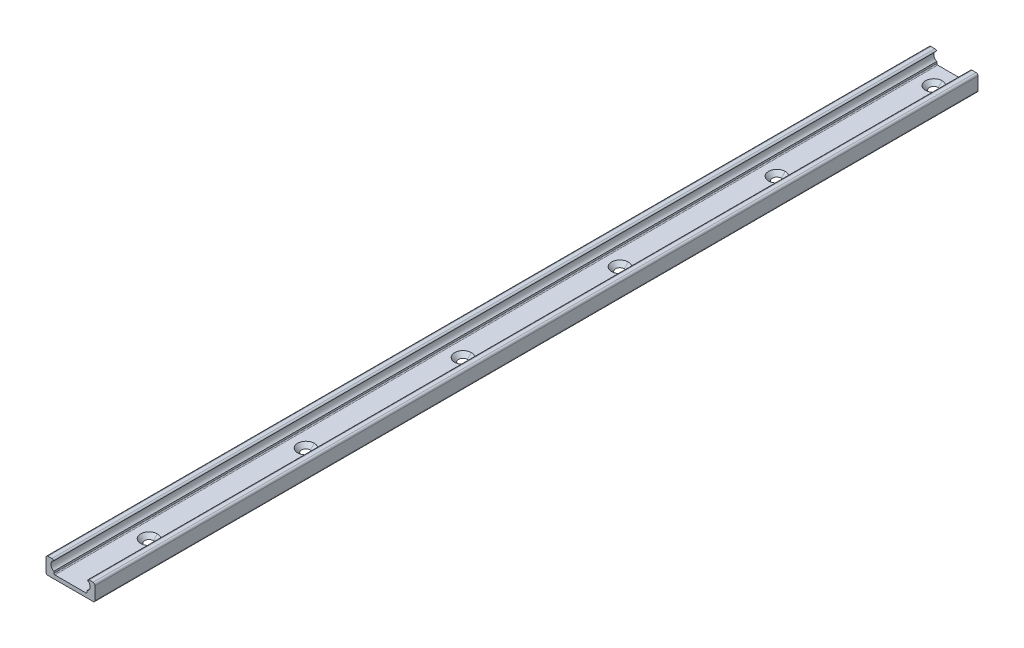
ISO-10303-21;
HEADER;
FILE_DESCRIPTION(('STEP AP214'),'2;1');
FILE_NAME('part.step','',(''),(''),'','','');
FILE_SCHEMA(('AUTOMOTIVE_DESIGN { 1 0 10303 214 1 1 1 1 }'));
ENDSEC;
DATA;
#1=APPLICATION_CONTEXT('core data for automotive mechanical design processes');
#2=APPLICATION_PROTOCOL_DEFINITION('international standard','automotive_design',2000,#1);
#3=PRODUCT_CONTEXT('',#1,'mechanical');
#4=PRODUCT('Part','Part','',(#3));
#5=PRODUCT_RELATED_PRODUCT_CATEGORY('part','',(#4));
#6=PRODUCT_DEFINITION_FORMATION('','',#4);
#7=PRODUCT_DEFINITION_CONTEXT('part definition',#1,'design');
#8=PRODUCT_DEFINITION('design','',#6,#7);
#9=PRODUCT_DEFINITION_SHAPE('','',#8);
#10=(LENGTH_UNIT() NAMED_UNIT(*) SI_UNIT(.MILLI.,.METRE.));
#11=(NAMED_UNIT(*) PLANE_ANGLE_UNIT() SI_UNIT($,.RADIAN.));
#12=(NAMED_UNIT(*) SI_UNIT($,.STERADIAN.) SOLID_ANGLE_UNIT());
#13=UNCERTAINTY_MEASURE_WITH_UNIT(LENGTH_MEASURE(1.E-05),#10,'distance_accuracy_value','');
#14=(GEOMETRIC_REPRESENTATION_CONTEXT(3) GLOBAL_UNCERTAINTY_ASSIGNED_CONTEXT((#13)) GLOBAL_UNIT_ASSIGNED_CONTEXT((#10,
#11,#12)) REPRESENTATION_CONTEXT('',''));
#15=CARTESIAN_POINT('',(0.,0.,0.));
#16=DIRECTION('',(0.,0.,1.));
#17=DIRECTION('',(1.,0.,0.));
#18=AXIS2_PLACEMENT_3D('',#15,#16,#17);
#19=CARTESIAN_POINT('',(-12.5,7.5,880.));
#20=DIRECTION('',(1.,0.,0.));
#21=DIRECTION('',(0.,0.,-1.));
#22=AXIS2_PLACEMENT_3D('',#19,#20,#21);
#23=PLANE('',#22);
#24=DIRECTION('',(0.,0.,-1.));
#25=VECTOR('',#24,1.);
#26=CARTESIAN_POINT('',(-12.5,7.5,880.));
#27=LINE('',#26,#25);
#28=CARTESIAN_POINT('',(-12.5,7.50000000000069,720.));
#29=VERTEX_POINT('',#28);
#30=CARTESIAN_POINT('',(-12.5,7.50000000000069,270.));
#31=VERTEX_POINT('',#30);
#32=EDGE_CURVE('E548',#29,#31,#27,.T.);
#33=ORIENTED_EDGE('',*,*,#32,.T.);
#34=DIRECTION('',(0.,-1.,0.));
#35=VECTOR('',#34,1.);
#36=CARTESIAN_POINT('',(-12.5,279.654937259125,270.));
#37=LINE('',#36,#35);
#38=CARTESIAN_POINT('',(-12.5,0.999999999999223,270.));
#39=VERTEX_POINT('',#38);
#40=EDGE_CURVE('E53',#31,#39,#37,.T.);
#41=ORIENTED_EDGE('',*,*,#40,.T.);
#42=DIRECTION('',(0.,0.,-1.));
#43=VECTOR('',#42,1.);
#44=CARTESIAN_POINT('',(-12.5,1.,880.));
#45=LINE('',#44,#43);
#46=CARTESIAN_POINT('',(-12.5,0.999999999999223,720.));
#47=VERTEX_POINT('',#46);
#48=EDGE_CURVE('E307',#47,#39,#45,.T.);
#49=ORIENTED_EDGE('',*,*,#48,.F.);
#50=DIRECTION('',(0.,1.,0.));
#51=VECTOR('',#50,1.);
#52=CARTESIAN_POINT('',(-12.5,-201.556443707464,720.));
#53=LINE('',#52,#51);
#54=EDGE_CURVE('E523',#47,#29,#53,.T.);
#55=ORIENTED_EDGE('',*,*,#54,.T.);
#56=EDGE_LOOP('',(#33,#41,#49,#55));
#57=FACE_BOUND('',#56,.T.);
#58=ADVANCED_FACE('F36',(#57),#23,.F.);
#59=CARTESIAN_POINT('',(-11.5000000000007,7.50000000000069,880.));
#60=DIRECTION('',(0.,0.,-1.));
#61=DIRECTION('',(0.707106781186161,-0.707106781186934,0.));
#62=AXIS2_PLACEMENT_3D('',#59,#60,#61);
#63=CYLINDRICAL_SURFACE('',#62,0.99999999999931);
#64=CARTESIAN_POINT('',(-11.5000000000007,7.50000000000069,270.));
#65=DIRECTION('',(0.,0.,1.));
#66=DIRECTION('',(1.,0.,0.));
#67=AXIS2_PLACEMENT_3D('',#64,#65,#66);
#68=CIRCLE('',#67,0.99999999999931);
#69=CARTESIAN_POINT('',(-11.5,8.50000000000001,270.));
#70=VERTEX_POINT('',#69);
#71=EDGE_CURVE('E528',#31,#70,#68,.F.);
#72=ORIENTED_EDGE('',*,*,#71,.F.);
#73=ORIENTED_EDGE('',*,*,#32,.F.);
#74=CARTESIAN_POINT('',(-11.5000000000007,7.50000000000069,720.));
#75=DIRECTION('',(0.,0.,-1.));
#76=DIRECTION('',(-1.,0.,0.));
#77=AXIS2_PLACEMENT_3D('',#74,#75,#76);
#78=CIRCLE('',#77,0.99999999999931);
#79=CARTESIAN_POINT('',(-11.5,8.5,720.));
#80=VERTEX_POINT('',#79);
#81=EDGE_CURVE('E374',#80,#29,#78,.F.);
#82=ORIENTED_EDGE('',*,*,#81,.F.);
#83=DIRECTION('',(0.,0.,-1.));
#84=VECTOR('',#83,1.);
#85=CARTESIAN_POINT('',(-11.5,8.5,880.));
#86=LINE('',#85,#84);
#87=EDGE_CURVE('E526',#80,#70,#86,.T.);
#88=ORIENTED_EDGE('',*,*,#87,.T.);
#89=EDGE_LOOP('',(#72,#73,#82,#88));
#90=FACE_BOUND('',#89,.T.);
#91=ADVANCED_FACE('F600',(#90),#63,.T.);
#92=CARTESIAN_POINT('',(-9.5,8.5,880.));
#93=DIRECTION('',(0.,-1.,0.));
#94=DIRECTION('',(0.,0.,-1.));
#95=AXIS2_PLACEMENT_3D('',#92,#93,#94);
#96=PLANE('',#95);
#97=DIRECTION('',(0.,0.,-1.));
#98=VECTOR('',#97,1.);
#99=CARTESIAN_POINT('',(-9.5,8.5,880.));
#100=LINE('',#99,#98);
#101=CARTESIAN_POINT('',(-9.5,8.5,720.));
#102=VERTEX_POINT('',#101);
#103=CARTESIAN_POINT('',(-9.5,8.50000000000001,270.));
#104=VERTEX_POINT('',#103);
#105=EDGE_CURVE('E568',#102,#104,#100,.T.);
#106=ORIENTED_EDGE('',*,*,#105,.T.);
#107=DIRECTION('',(1.,0.,0.));
#108=VECTOR('',#107,1.);
#109=CARTESIAN_POINT('',(12.5,8.50000000000001,270.));
#110=LINE('',#109,#108);
#111=EDGE_CURVE('E530',#70,#104,#110,.T.);
#112=ORIENTED_EDGE('',*,*,#111,.F.);
#113=ORIENTED_EDGE('',*,*,#87,.F.);
#114=DIRECTION('',(-1.,0.,0.));
#115=VECTOR('',#114,1.);
#116=CARTESIAN_POINT('',(-12.5,8.5,720.));
#117=LINE('',#116,#115);
#118=EDGE_CURVE('E496',#102,#80,#117,.T.);
#119=ORIENTED_EDGE('',*,*,#118,.F.);
#120=EDGE_LOOP('',(#106,#112,#113,#119));
#121=FACE_BOUND('',#120,.T.);
#122=ADVANCED_FACE('F606',(#121),#96,.F.);
#123=CARTESIAN_POINT('',(-9.5,7.5,880.));
#124=DIRECTION('',(0.,0.,-1.));
#125=DIRECTION('',(-0.52762171224576,-0.849479445758902,0.));
#126=AXIS2_PLACEMENT_3D('',#123,#124,#125);
#127=CYLINDRICAL_SURFACE('',#126,1.);
#128=CARTESIAN_POINT('',(-9.5,7.5,270.));
#129=DIRECTION('',(0.,0.,1.));
#130=DIRECTION('',(1.,0.,0.));
#131=AXIS2_PLACEMENT_3D('',#128,#129,#130);
#132=CIRCLE('',#131,1.);
#133=CARTESIAN_POINT('',(-8.6035924033162,7.943230662982,270.));
#134=VERTEX_POINT('',#133);
#135=EDGE_CURVE('E254',#104,#134,#132,.F.);
#136=ORIENTED_EDGE('',*,*,#135,.F.);
#137=ORIENTED_EDGE('',*,*,#105,.F.);
#138=CARTESIAN_POINT('',(-9.5,7.5,720.));
#139=DIRECTION('',(0.,0.,-1.));
#140=DIRECTION('',(-1.,0.,0.));
#141=AXIS2_PLACEMENT_3D('',#138,#139,#140);
#142=CIRCLE('',#141,1.);
#143=CARTESIAN_POINT('',(-8.6035924033162,7.943230662982,720.));
#144=VERTEX_POINT('',#143);
#145=EDGE_CURVE('E494',#144,#102,#142,.F.);
#146=ORIENTED_EDGE('',*,*,#145,.F.);
#147=DIRECTION('',(0.,0.,-1.));
#148=VECTOR('',#147,1.);
#149=CARTESIAN_POINT('',(-8.6035924033162,7.943230662982,880.));
#150=LINE('',#149,#148);
#151=EDGE_CURVE('E571',#144,#134,#150,.T.);
#152=ORIENTED_EDGE('',*,*,#151,.T.);
#153=EDGE_LOOP('',(#136,#137,#146,#152));
#154=FACE_BOUND('',#153,.T.);
#155=ADVANCED_FACE('F611',(#154),#127,.T.);
#156=CARTESIAN_POINT('',(-7.5,5.7,880.));
#157=DIRECTION('',(0.,0.,-1.));
#158=DIRECTION('',(0.999739148561569,0.022839326465319,0.));
#159=AXIS2_PLACEMENT_3D('',#156,#157,#158);
#160=CYLINDRICAL_SURFACE('',#159,2.5);
#161=DIRECTION('',(0.,0.,-1.));
#162=VECTOR('',#161,1.);
#163=CARTESIAN_POINT('',(-8.5,3.4087121525221,880.));
#164=LINE('',#163,#162);
#165=CARTESIAN_POINT('',(-8.5,3.4087121525221,720.));
#166=VERTEX_POINT('',#165);
#167=CARTESIAN_POINT('',(-8.5,3.4087121525221,270.));
#168=VERTEX_POINT('',#167);
#169=EDGE_CURVE('E535',#166,#168,#164,.T.);
#170=ORIENTED_EDGE('',*,*,#169,.T.);
#171=CARTESIAN_POINT('',(-7.5,5.7,270.));
#172=DIRECTION('',(0.,0.,1.));
#173=DIRECTION('',(1.,0.,0.));
#174=AXIS2_PLACEMENT_3D('',#171,#172,#173);
#175=CIRCLE('',#174,2.5);
#176=EDGE_CURVE('E502',#168,#134,#175,.F.);
#177=ORIENTED_EDGE('',*,*,#176,.T.);
#178=ORIENTED_EDGE('',*,*,#151,.F.);
#179=CARTESIAN_POINT('',(-7.5,5.7,720.));
#180=DIRECTION('',(0.,0.,-1.));
#181=DIRECTION('',(-1.,0.,0.));
#182=AXIS2_PLACEMENT_3D('',#179,#180,#181);
#183=CIRCLE('',#182,2.5);
#184=EDGE_CURVE('E498',#144,#166,#183,.F.);
#185=ORIENTED_EDGE('',*,*,#184,.T.);
#186=EDGE_LOOP('',(#170,#177,#178,#185));
#187=FACE_BOUND('',#186,.T.);
#188=ADVANCED_FACE('F614',(#187),#160,.F.);
#189=CARTESIAN_POINT('',(-8.5,2.5,880.));
#190=DIRECTION('',(-1.,0.,0.));
#191=DIRECTION('',(0.,0.,1.));
#192=AXIS2_PLACEMENT_3D('',#189,#190,#191);
#193=PLANE('',#192);
#194=DIRECTION('',(0.,0.,-1.));
#195=VECTOR('',#194,1.);
#196=CARTESIAN_POINT('',(-8.5,2.5,880.));
#197=LINE('',#196,#195);
#198=CARTESIAN_POINT('',(-8.5,2.5,720.));
#199=VERTEX_POINT('',#198);
#200=CARTESIAN_POINT('',(-8.5,2.5,270.));
#201=VERTEX_POINT('',#200);
#202=EDGE_CURVE('E501',#199,#201,#197,.T.);
#203=ORIENTED_EDGE('',*,*,#202,.T.);
#204=DIRECTION('',(0.,1.,0.));
#205=VECTOR('',#204,1.);
#206=CARTESIAN_POINT('',(-8.5,2.5,270.));
#207=LINE('',#206,#205);
#208=EDGE_CURVE('E507',#201,#168,#207,.T.);
#209=ORIENTED_EDGE('',*,*,#208,.T.);
#210=ORIENTED_EDGE('',*,*,#169,.F.);
#211=DIRECTION('',(0.,-1.,0.));
#212=VECTOR('',#211,1.);
#213=CARTESIAN_POINT('',(-8.5,2.5,720.));
#214=LINE('',#213,#212);
#215=EDGE_CURVE('E503',#166,#199,#214,.T.);
#216=ORIENTED_EDGE('',*,*,#215,.T.);
#217=EDGE_LOOP('',(#203,#209,#210,#216));
#218=FACE_BOUND('',#217,.T.);
#219=ADVANCED_FACE('F617',(#218),#193,.F.);
#220=CARTESIAN_POINT('',(-8.00000000000009,2.49999999999991,880.));
#221=DIRECTION('',(0.,0.,-1.));
#222=DIRECTION('',(0.707106781186547,0.707106781186548,0.));
#223=AXIS2_PLACEMENT_3D('',#220,#221,#222);
#224=CYLINDRICAL_SURFACE('',#223,0.499999999999911);
#225=DIRECTION('',(0.,0.,-1.));
#226=VECTOR('',#225,1.);
#227=CARTESIAN_POINT('',(-8.,2.,880.));
#228=LINE('',#227,#226);
#229=CARTESIAN_POINT('',(-8.,2.,720.));
#230=VERTEX_POINT('',#229);
#231=CARTESIAN_POINT('',(-8.,2.,270.));
#232=VERTEX_POINT('',#231);
#233=EDGE_CURVE('E506',#230,#232,#228,.T.);
#234=ORIENTED_EDGE('',*,*,#233,.T.);
#235=CARTESIAN_POINT('',(-8.00000000000009,2.49999999999991,270.));
#236=DIRECTION('',(0.,0.,1.));
#237=DIRECTION('',(1.,0.,0.));
#238=AXIS2_PLACEMENT_3D('',#235,#236,#237);
#239=CIRCLE('',#238,0.499999999999911);
#240=EDGE_CURVE('E510',#232,#201,#239,.F.);
#241=ORIENTED_EDGE('',*,*,#240,.T.);
#242=ORIENTED_EDGE('',*,*,#202,.F.);
#243=CARTESIAN_POINT('',(-8.00000000000009,2.49999999999991,720.));
#244=DIRECTION('',(0.,0.,-1.));
#245=DIRECTION('',(-1.,0.,0.));
#246=AXIS2_PLACEMENT_3D('',#243,#244,#245);
#247=CIRCLE('',#246,0.499999999999911);
#248=EDGE_CURVE('E314',#199,#230,#247,.F.);
#249=ORIENTED_EDGE('',*,*,#248,.T.);
#250=EDGE_LOOP('',(#234,#241,#242,#249));
#251=FACE_BOUND('',#250,.T.);
#252=ADVANCED_FACE('F582',(#251),#224,.F.);
#253=CARTESIAN_POINT('',(8.,2.,880.));
#254=DIRECTION('',(0.,-1.,0.));
#255=DIRECTION('',(0.,0.,-1.));
#256=AXIS2_PLACEMENT_3D('',#253,#254,#255);
#257=PLANE('',#256);
#258=DIRECTION('',(0.,0.,-1.));
#259=VECTOR('',#258,1.);
#260=CARTESIAN_POINT('',(8.,2.,880.));
#261=LINE('',#260,#259);
#262=CARTESIAN_POINT('',(8.,2.,720.));
#263=VERTEX_POINT('',#262);
#264=CARTESIAN_POINT('',(8.,2.,270.));
#265=VERTEX_POINT('',#264);
#266=EDGE_CURVE('E310',#263,#265,#261,.T.);
#267=ORIENTED_EDGE('',*,*,#266,.T.);
#268=DIRECTION('',(-1.,0.,0.));
#269=VECTOR('',#268,1.);
#270=CARTESIAN_POINT('',(8.,2.,270.));
#271=LINE('',#270,#269);
#272=EDGE_CURVE('E313',#265,#232,#271,.T.);
#273=ORIENTED_EDGE('',*,*,#272,.T.);
#274=ORIENTED_EDGE('',*,*,#233,.F.);
#275=DIRECTION('',(1.,0.,0.));
#276=VECTOR('',#275,1.);
#277=CARTESIAN_POINT('',(8.,2.,720.));
#278=LINE('',#277,#276);
#279=EDGE_CURVE('E326',#230,#263,#278,.T.);
#280=ORIENTED_EDGE('',*,*,#279,.T.);
#281=EDGE_LOOP('',(#267,#273,#274,#280));
#282=FACE_BOUND('',#281,.T.);
#283=CARTESIAN_POINT('',(0.,2.,280.));
#284=DIRECTION('',(0.,-1.,0.));
#285=DIRECTION('',(0.,0.,-1.));
#286=AXIS2_PLACEMENT_3D('',#283,#284,#285);
#287=CIRCLE('',#286,4.25);
#288=CARTESIAN_POINT('',(0.,2.,275.75));
#289=VERTEX_POINT('',#288);
#290=CARTESIAN_POINT('',(0.,2.,284.25));
#291=VERTEX_POINT('',#290);
#292=EDGE_CURVE('E323',#289,#291,#287,.T.);
#293=ORIENTED_EDGE('',*,*,#292,.T.);
#294=CARTESIAN_POINT('',(0.,2.,280.));
#295=DIRECTION('',(0.,-1.,0.));
#296=DIRECTION('',(0.,0.,-1.));
#297=AXIS2_PLACEMENT_3D('',#294,#295,#296);
#298=CIRCLE('',#297,4.25);
#299=EDGE_CURVE('E325',#291,#289,#298,.T.);
#300=ORIENTED_EDGE('',*,*,#299,.T.);
#301=EDGE_LOOP('',(#293,#300));
#302=FACE_BOUND('',#301,.T.);
#303=CARTESIAN_POINT('',(0.,2.,360.));
#304=DIRECTION('',(0.,-1.,0.));
#305=DIRECTION('',(0.,0.,-1.));
#306=AXIS2_PLACEMENT_3D('',#303,#304,#305);
#307=CIRCLE('',#306,4.25);
#308=CARTESIAN_POINT('',(0.,2.,355.75));
#309=VERTEX_POINT('',#308);
#310=CARTESIAN_POINT('',(0.,2.,364.25));
#311=VERTEX_POINT('',#310);
#312=EDGE_CURVE('E330',#309,#311,#307,.T.);
#313=ORIENTED_EDGE('',*,*,#312,.T.);
#314=CARTESIAN_POINT('',(0.,2.,360.));
#315=DIRECTION('',(0.,-1.,0.));
#316=DIRECTION('',(0.,0.,-1.));
#317=AXIS2_PLACEMENT_3D('',#314,#315,#316);
#318=CIRCLE('',#317,4.25);
#319=EDGE_CURVE('E334',#311,#309,#318,.T.);
#320=ORIENTED_EDGE('',*,*,#319,.T.);
#321=EDGE_LOOP('',(#313,#320));
#322=FACE_BOUND('',#321,.T.);
#323=CARTESIAN_POINT('',(0.,2.,440.));
#324=DIRECTION('',(0.,-1.,0.));
#325=DIRECTION('',(0.,0.,-1.));
#326=AXIS2_PLACEMENT_3D('',#323,#324,#325);
#327=CIRCLE('',#326,4.25);
#328=CARTESIAN_POINT('',(0.,2.,435.75));
#329=VERTEX_POINT('',#328);
#330=CARTESIAN_POINT('',(0.,2.,444.25));
#331=VERTEX_POINT('',#330);
#332=EDGE_CURVE('E338',#329,#331,#327,.T.);
#333=ORIENTED_EDGE('',*,*,#332,.T.);
#334=CARTESIAN_POINT('',(0.,2.,440.));
#335=DIRECTION('',(0.,-1.,0.));
#336=DIRECTION('',(0.,0.,-1.));
#337=AXIS2_PLACEMENT_3D('',#334,#335,#336);
#338=CIRCLE('',#337,4.25);
#339=EDGE_CURVE('E342',#331,#329,#338,.T.);
#340=ORIENTED_EDGE('',*,*,#339,.T.);
#341=EDGE_LOOP('',(#333,#340));
#342=FACE_BOUND('',#341,.T.);
#343=CARTESIAN_POINT('',(0.,2.,520.));
#344=DIRECTION('',(0.,-1.,0.));
#345=DIRECTION('',(0.,0.,-1.));
#346=AXIS2_PLACEMENT_3D('',#343,#344,#345);
#347=CIRCLE('',#346,4.25);
#348=CARTESIAN_POINT('',(0.,2.,515.75));
#349=VERTEX_POINT('',#348);
#350=CARTESIAN_POINT('',(0.,2.,524.25));
#351=VERTEX_POINT('',#350);
#352=EDGE_CURVE('E346',#349,#351,#347,.T.);
#353=ORIENTED_EDGE('',*,*,#352,.T.);
#354=CARTESIAN_POINT('',(0.,2.,520.));
#355=DIRECTION('',(0.,-1.,0.));
#356=DIRECTION('',(0.,0.,-1.));
#357=AXIS2_PLACEMENT_3D('',#354,#355,#356);
#358=CIRCLE('',#357,4.25);
#359=EDGE_CURVE('E350',#351,#349,#358,.T.);
#360=ORIENTED_EDGE('',*,*,#359,.T.);
#361=EDGE_LOOP('',(#353,#360));
#362=FACE_BOUND('',#361,.T.);
#363=CARTESIAN_POINT('',(0.,2.,600.));
#364=DIRECTION('',(0.,-1.,0.));
#365=DIRECTION('',(0.,0.,-1.));
#366=AXIS2_PLACEMENT_3D('',#363,#364,#365);
#367=CIRCLE('',#366,4.25);
#368=CARTESIAN_POINT('',(0.,2.,595.75));
#369=VERTEX_POINT('',#368);
#370=CARTESIAN_POINT('',(0.,2.,604.25));
#371=VERTEX_POINT('',#370);
#372=EDGE_CURVE('E354',#369,#371,#367,.T.);
#373=ORIENTED_EDGE('',*,*,#372,.T.);
#374=CARTESIAN_POINT('',(0.,2.,600.));
#375=DIRECTION('',(0.,-1.,0.));
#376=DIRECTION('',(0.,0.,-1.));
#377=AXIS2_PLACEMENT_3D('',#374,#375,#376);
#378=CIRCLE('',#377,4.25);
#379=EDGE_CURVE('E358',#371,#369,#378,.T.);
#380=ORIENTED_EDGE('',*,*,#379,.T.);
#381=EDGE_LOOP('',(#373,#380));
#382=FACE_BOUND('',#381,.T.);
#383=CARTESIAN_POINT('',(0.,2.,680.));
#384=DIRECTION('',(0.,-1.,0.));
#385=DIRECTION('',(0.,0.,-1.));
#386=AXIS2_PLACEMENT_3D('',#383,#384,#385);
#387=CIRCLE('',#386,4.25);
#388=CARTESIAN_POINT('',(0.,2.,675.75));
#389=VERTEX_POINT('',#388);
#390=CARTESIAN_POINT('',(0.,2.,684.25));
#391=VERTEX_POINT('',#390);
#392=EDGE_CURVE('E362',#389,#391,#387,.T.);
#393=ORIENTED_EDGE('',*,*,#392,.T.);
#394=CARTESIAN_POINT('',(0.,2.,680.));
#395=DIRECTION('',(0.,-1.,0.));
#396=DIRECTION('',(0.,0.,-1.));
#397=AXIS2_PLACEMENT_3D('',#394,#395,#396);
#398=CIRCLE('',#397,4.25);
#399=EDGE_CURVE('E308',#391,#389,#398,.T.);
#400=ORIENTED_EDGE('',*,*,#399,.T.);
#401=EDGE_LOOP('',(#393,#400));
#402=FACE_BOUND('',#401,.T.);
#403=ADVANCED_FACE('F585',(#282,#302,#322,#342,#362,#382,#402),#257,.F.);
#404=CARTESIAN_POINT('',(-11.5,0.,880.));
#405=DIRECTION('',(0.,1.,0.));
#406=DIRECTION('',(0.,0.,1.));
#407=AXIS2_PLACEMENT_3D('',#404,#405,#406);
#408=PLANE('',#407);
#409=CARTESIAN_POINT('',(0.,0.,280.));
#410=DIRECTION('',(0.,-1.,0.));
#411=DIRECTION('',(0.,0.,-1.));
#412=AXIS2_PLACEMENT_3D('',#409,#410,#411);
#413=CIRCLE('',#412,2.25);
#414=CARTESIAN_POINT('',(0.,0.,282.25));
#415=VERTEX_POINT('',#414);
#416=CARTESIAN_POINT('',(0.,0.,277.75));
#417=VERTEX_POINT('',#416);
#418=EDGE_CURVE('E371',#415,#417,#413,.T.);
#419=ORIENTED_EDGE('',*,*,#418,.F.);
#420=CARTESIAN_POINT('',(0.,0.,280.));
#421=DIRECTION('',(0.,-1.,0.));
#422=DIRECTION('',(0.,0.,-1.));
#423=AXIS2_PLACEMENT_3D('',#420,#421,#422);
#424=CIRCLE('',#423,2.25);
#425=EDGE_CURVE('E378',#417,#415,#424,.T.);
#426=ORIENTED_EDGE('',*,*,#425,.F.);
#427=EDGE_LOOP('',(#419,#426));
#428=FACE_BOUND('',#427,.T.);
#429=CARTESIAN_POINT('',(0.,0.,360.));
#430=DIRECTION('',(0.,-1.,0.));
#431=DIRECTION('',(0.,0.,-1.));
#432=AXIS2_PLACEMENT_3D('',#429,#430,#431);
#433=CIRCLE('',#432,2.25);
#434=CARTESIAN_POINT('',(0.,0.,362.25));
#435=VERTEX_POINT('',#434);
#436=CARTESIAN_POINT('',(0.,0.,357.75));
#437=VERTEX_POINT('',#436);
#438=EDGE_CURVE('E382',#435,#437,#433,.T.);
#439=ORIENTED_EDGE('',*,*,#438,.F.);
#440=CARTESIAN_POINT('',(0.,0.,360.));
#441=DIRECTION('',(0.,-1.,0.));
#442=DIRECTION('',(0.,0.,-1.));
#443=AXIS2_PLACEMENT_3D('',#440,#441,#442);
#444=CIRCLE('',#443,2.25);
#445=EDGE_CURVE('E390',#437,#435,#444,.T.);
#446=ORIENTED_EDGE('',*,*,#445,.F.);
#447=EDGE_LOOP('',(#439,#446));
#448=FACE_BOUND('',#447,.T.);
#449=CARTESIAN_POINT('',(0.,0.,440.));
#450=DIRECTION('',(0.,-1.,0.));
#451=DIRECTION('',(0.,0.,-1.));
#452=AXIS2_PLACEMENT_3D('',#449,#450,#451);
#453=CIRCLE('',#452,2.25);
#454=CARTESIAN_POINT('',(0.,0.,442.25));
#455=VERTEX_POINT('',#454);
#456=CARTESIAN_POINT('',(0.,0.,437.75));
#457=VERTEX_POINT('',#456);
#458=EDGE_CURVE('E394',#455,#457,#453,.T.);
#459=ORIENTED_EDGE('',*,*,#458,.F.);
#460=CARTESIAN_POINT('',(0.,0.,440.));
#461=DIRECTION('',(0.,-1.,0.));
#462=DIRECTION('',(0.,0.,-1.));
#463=AXIS2_PLACEMENT_3D('',#460,#461,#462);
#464=CIRCLE('',#463,2.25);
#465=EDGE_CURVE('E402',#457,#455,#464,.T.);
#466=ORIENTED_EDGE('',*,*,#465,.F.);
#467=EDGE_LOOP('',(#459,#466));
#468=FACE_BOUND('',#467,.T.);
#469=CARTESIAN_POINT('',(0.,0.,520.));
#470=DIRECTION('',(0.,-1.,0.));
#471=DIRECTION('',(0.,0.,-1.));
#472=AXIS2_PLACEMENT_3D('',#469,#470,#471);
#473=CIRCLE('',#472,2.25);
#474=CARTESIAN_POINT('',(0.,0.,522.25));
#475=VERTEX_POINT('',#474);
#476=CARTESIAN_POINT('',(0.,0.,517.75));
#477=VERTEX_POINT('',#476);
#478=EDGE_CURVE('E406',#475,#477,#473,.T.);
#479=ORIENTED_EDGE('',*,*,#478,.F.);
#480=CARTESIAN_POINT('',(0.,0.,520.));
#481=DIRECTION('',(0.,-1.,0.));
#482=DIRECTION('',(0.,0.,-1.));
#483=AXIS2_PLACEMENT_3D('',#480,#481,#482);
#484=CIRCLE('',#483,2.25);
#485=EDGE_CURVE('E414',#477,#475,#484,.T.);
#486=ORIENTED_EDGE('',*,*,#485,.F.);
#487=EDGE_LOOP('',(#479,#486));
#488=FACE_BOUND('',#487,.T.);
#489=CARTESIAN_POINT('',(0.,0.,600.));
#490=DIRECTION('',(0.,-1.,0.));
#491=DIRECTION('',(0.,0.,-1.));
#492=AXIS2_PLACEMENT_3D('',#489,#490,#491);
#493=CIRCLE('',#492,2.25);
#494=CARTESIAN_POINT('',(0.,0.,602.25));
#495=VERTEX_POINT('',#494);
#496=CARTESIAN_POINT('',(0.,0.,597.75));
#497=VERTEX_POINT('',#496);
#498=EDGE_CURVE('E418',#495,#497,#493,.T.);
#499=ORIENTED_EDGE('',*,*,#498,.F.);
#500=CARTESIAN_POINT('',(0.,0.,600.));
#501=DIRECTION('',(0.,-1.,0.));
#502=DIRECTION('',(0.,0.,-1.));
#503=AXIS2_PLACEMENT_3D('',#500,#501,#502);
#504=CIRCLE('',#503,2.25);
#505=EDGE_CURVE('E426',#497,#495,#504,.T.);
#506=ORIENTED_EDGE('',*,*,#505,.F.);
#507=EDGE_LOOP('',(#499,#506));
#508=FACE_BOUND('',#507,.T.);
#509=CARTESIAN_POINT('',(0.,0.,680.));
#510=DIRECTION('',(0.,-1.,0.));
#511=DIRECTION('',(0.,0.,-1.));
#512=AXIS2_PLACEMENT_3D('',#509,#510,#511);
#513=CIRCLE('',#512,2.25);
#514=CARTESIAN_POINT('',(0.,0.,682.25));
#515=VERTEX_POINT('',#514);
#516=CARTESIAN_POINT('',(0.,0.,677.75));
#517=VERTEX_POINT('',#516);
#518=EDGE_CURVE('E430',#515,#517,#513,.T.);
#519=ORIENTED_EDGE('',*,*,#518,.F.);
#520=CARTESIAN_POINT('',(0.,0.,680.));
#521=DIRECTION('',(0.,-1.,0.));
#522=DIRECTION('',(0.,0.,-1.));
#523=AXIS2_PLACEMENT_3D('',#520,#521,#522);
#524=CIRCLE('',#523,2.25);
#525=EDGE_CURVE('E294',#517,#515,#524,.T.);
#526=ORIENTED_EDGE('',*,*,#525,.F.);
#527=EDGE_LOOP('',(#519,#526));
#528=FACE_BOUND('',#527,.T.);
#529=DIRECTION('',(0.,0.,-1.));
#530=VECTOR('',#529,1.);
#531=CARTESIAN_POINT('',(-11.5,0.,880.));
#532=LINE('',#531,#530);
#533=CARTESIAN_POINT('',(-11.5000000000008,0.,720.));
#534=VERTEX_POINT('',#533);
#535=CARTESIAN_POINT('',(-11.5000000000008,0.,270.));
#536=VERTEX_POINT('',#535);
#537=EDGE_CURVE('E303',#534,#536,#532,.T.);
#538=ORIENTED_EDGE('',*,*,#537,.T.);
#539=DIRECTION('',(-1.,0.,0.));
#540=VECTOR('',#539,1.);
#541=CARTESIAN_POINT('',(12.5,0.,270.));
#542=LINE('',#541,#540);
#543=CARTESIAN_POINT('',(11.5000000000008,0.,270.));
#544=VERTEX_POINT('',#543);
#545=EDGE_CURVE('E40',#544,#536,#542,.T.);
#546=ORIENTED_EDGE('',*,*,#545,.F.);
#547=DIRECTION('',(0.,0.,-1.));
#548=VECTOR('',#547,1.);
#549=CARTESIAN_POINT('',(11.5,0.,880.));
#550=LINE('',#549,#548);
#551=CARTESIAN_POINT('',(11.5,0.,720.));
#552=VERTEX_POINT('',#551);
#553=EDGE_CURVE('E290',#552,#544,#550,.T.);
#554=ORIENTED_EDGE('',*,*,#553,.F.);
#555=DIRECTION('',(1.,0.,0.));
#556=VECTOR('',#555,1.);
#557=CARTESIAN_POINT('',(-12.5,0.,720.));
#558=LINE('',#557,#556);
#559=EDGE_CURVE('E289',#534,#552,#558,.T.);
#560=ORIENTED_EDGE('',*,*,#559,.F.);
#561=EDGE_LOOP('',(#538,#546,#554,#560));
#562=FACE_BOUND('',#561,.T.);
#563=ADVANCED_FACE('F647',(#428,#448,#468,#488,#508,#528,#562),#408,.F.);
#564=CARTESIAN_POINT('',(-11.5000000000008,0.999999999999223,880.));
#565=DIRECTION('',(0.,0.,-1.));
#566=DIRECTION('',(0.707106781186115,0.70710678118698,0.));
#567=AXIS2_PLACEMENT_3D('',#564,#565,#566);
#568=CYLINDRICAL_SURFACE('',#567,0.999999999999222);
#569=CARTESIAN_POINT('',(-11.5000000000008,0.999999999999223,270.));
#570=DIRECTION('',(0.,0.,1.));
#571=DIRECTION('',(1.,0.,0.));
#572=AXIS2_PLACEMENT_3D('',#569,#570,#571);
#573=CIRCLE('',#572,0.999999999999222);
#574=EDGE_CURVE('E11',#536,#39,#573,.F.);
#575=ORIENTED_EDGE('',*,*,#574,.F.);
#576=ORIENTED_EDGE('',*,*,#537,.F.);
#577=CARTESIAN_POINT('',(-11.5000000000008,0.999999999999223,720.));
#578=DIRECTION('',(0.,0.,-1.));
#579=DIRECTION('',(-1.,0.,0.));
#580=AXIS2_PLACEMENT_3D('',#577,#578,#579);
#581=CIRCLE('',#580,0.999999999999222);
#582=EDGE_CURVE('E492',#47,#534,#581,.F.);
#583=ORIENTED_EDGE('',*,*,#582,.F.);
#584=ORIENTED_EDGE('',*,*,#48,.T.);
#585=EDGE_LOOP('',(#575,#576,#583,#584));
#586=FACE_BOUND('',#585,.T.);
#587=ADVANCED_FACE('F595',(#586),#568,.T.);
#588=CARTESIAN_POINT('',(8.00000000000009,2.49999999999991,880.));
#589=DIRECTION('',(0.,0.,-1.));
#590=DIRECTION('',(-0.707106781186547,0.707106781186548,0.));
#591=AXIS2_PLACEMENT_3D('',#588,#589,#590);
#592=CYLINDRICAL_SURFACE('',#591,0.49999999999991);
#593=DIRECTION('',(0.,0.,-1.));
#594=VECTOR('',#593,1.);
#595=CARTESIAN_POINT('',(8.5,2.5,880.));
#596=LINE('',#595,#594);
#597=CARTESIAN_POINT('',(8.5,2.5,720.));
#598=VERTEX_POINT('',#597);
#599=CARTESIAN_POINT('',(8.5,2.5,270.));
#600=VERTEX_POINT('',#599);
#601=EDGE_CURVE('E315',#598,#600,#596,.T.);
#602=ORIENTED_EDGE('',*,*,#601,.T.);
#603=CARTESIAN_POINT('',(8.00000000000009,2.49999999999991,270.));
#604=DIRECTION('',(0.,0.,1.));
#605=DIRECTION('',(1.,0.,0.));
#606=AXIS2_PLACEMENT_3D('',#603,#604,#605);
#607=CIRCLE('',#606,0.49999999999991);
#608=EDGE_CURVE('E515',#600,#265,#607,.F.);
#609=ORIENTED_EDGE('',*,*,#608,.T.);
#610=ORIENTED_EDGE('',*,*,#266,.F.);
#611=CARTESIAN_POINT('',(8.00000000000009,2.49999999999991,720.));
#612=DIRECTION('',(0.,0.,-1.));
#613=DIRECTION('',(-1.,0.,0.));
#614=AXIS2_PLACEMENT_3D('',#611,#612,#613);
#615=CIRCLE('',#614,0.49999999999991);
#616=EDGE_CURVE('E513',#263,#598,#615,.F.);
#617=ORIENTED_EDGE('',*,*,#616,.T.);
#618=EDGE_LOOP('',(#602,#609,#610,#617));
#619=FACE_BOUND('',#618,.T.);
#620=ADVANCED_FACE('F590',(#619),#592,.F.);
#621=CARTESIAN_POINT('',(8.5,3.4087121525221,880.));
#622=DIRECTION('',(1.,0.,0.));
#623=DIRECTION('',(0.,0.,-1.));
#624=AXIS2_PLACEMENT_3D('',#621,#622,#623);
#625=PLANE('',#624);
#626=DIRECTION('',(0.,0.,-1.));
#627=VECTOR('',#626,1.);
#628=CARTESIAN_POINT('',(8.5,3.4087121525221,880.));
#629=LINE('',#628,#627);
#630=CARTESIAN_POINT('',(8.5,3.4087121525221,720.));
#631=VERTEX_POINT('',#630);
#632=CARTESIAN_POINT('',(8.5,3.4087121525221,270.));
#633=VERTEX_POINT('',#632);
#634=EDGE_CURVE('E265',#631,#633,#629,.T.);
#635=ORIENTED_EDGE('',*,*,#634,.T.);
#636=DIRECTION('',(0.,-1.,0.));
#637=VECTOR('',#636,1.);
#638=CARTESIAN_POINT('',(8.5,3.4087121525221,270.));
#639=LINE('',#638,#637);
#640=EDGE_CURVE('E238',#633,#600,#639,.T.);
#641=ORIENTED_EDGE('',*,*,#640,.T.);
#642=ORIENTED_EDGE('',*,*,#601,.F.);
#643=DIRECTION('',(0.,1.,0.));
#644=VECTOR('',#643,1.);
#645=CARTESIAN_POINT('',(8.5,3.4087121525221,720.));
#646=LINE('',#645,#644);
#647=EDGE_CURVE('E258',#598,#631,#646,.T.);
#648=ORIENTED_EDGE('',*,*,#647,.T.);
#649=EDGE_LOOP('',(#635,#641,#642,#648));
#650=FACE_BOUND('',#649,.T.);
#651=ADVANCED_FACE('F619',(#650),#625,.F.);
#652=CARTESIAN_POINT('',(7.5,5.7,880.));
#653=DIRECTION('',(0.,0.,-1.));
#654=DIRECTION('',(-0.999739148561569,0.0228393264653192,0.));
#655=AXIS2_PLACEMENT_3D('',#652,#653,#654);
#656=CYLINDRICAL_SURFACE('',#655,2.5);
#657=DIRECTION('',(0.,0.,-1.));
#658=VECTOR('',#657,1.);
#659=CARTESIAN_POINT('',(8.6035924033162,7.943230662982,880.));
#660=LINE('',#659,#658);
#661=CARTESIAN_POINT('',(8.6035924033162,7.943230662982,720.));
#662=VERTEX_POINT('',#661);
#663=CARTESIAN_POINT('',(8.6035924033162,7.943230662982,270.));
#664=VERTEX_POINT('',#663);
#665=EDGE_CURVE('E244',#662,#664,#660,.T.);
#666=ORIENTED_EDGE('',*,*,#665,.T.);
#667=CARTESIAN_POINT('',(7.5,5.7,270.));
#668=DIRECTION('',(0.,0.,1.));
#669=DIRECTION('',(1.,0.,0.));
#670=AXIS2_PLACEMENT_3D('',#667,#668,#669);
#671=CIRCLE('',#670,2.5);
#672=EDGE_CURVE('E233',#664,#633,#671,.F.);
#673=ORIENTED_EDGE('',*,*,#672,.T.);
#674=ORIENTED_EDGE('',*,*,#634,.F.);
#675=CARTESIAN_POINT('',(7.5,5.7,720.));
#676=DIRECTION('',(0.,0.,-1.));
#677=DIRECTION('',(-1.,0.,0.));
#678=AXIS2_PLACEMENT_3D('',#675,#676,#677);
#679=CIRCLE('',#678,2.5);
#680=EDGE_CURVE('E243',#631,#662,#679,.F.);
#681=ORIENTED_EDGE('',*,*,#680,.T.);
#682=EDGE_LOOP('',(#666,#673,#674,#681));
#683=FACE_BOUND('',#682,.T.);
#684=ADVANCED_FACE('F257',(#683),#656,.F.);
#685=CARTESIAN_POINT('',(9.5,7.5,880.));
#686=DIRECTION('',(0.,0.,-1.));
#687=DIRECTION('',(0.52762171224576,-0.849479445758902,0.));
#688=AXIS2_PLACEMENT_3D('',#685,#686,#687);
#689=CYLINDRICAL_SURFACE('',#688,1.);
#690=CARTESIAN_POINT('',(9.5,7.5,270.));
#691=DIRECTION('',(0.,0.,1.));
#692=DIRECTION('',(1.,0.,0.));
#693=AXIS2_PLACEMENT_3D('',#690,#691,#692);
#694=CIRCLE('',#693,1.);
#695=CARTESIAN_POINT('',(9.5,8.50000000000001,270.));
#696=VERTEX_POINT('',#695);
#697=EDGE_CURVE('E235',#664,#696,#694,.F.);
#698=ORIENTED_EDGE('',*,*,#697,.F.);
#699=ORIENTED_EDGE('',*,*,#665,.F.);
#700=CARTESIAN_POINT('',(9.5,7.5,720.));
#701=DIRECTION('',(0.,0.,-1.));
#702=DIRECTION('',(-1.,0.,0.));
#703=AXIS2_PLACEMENT_3D('',#700,#701,#702);
#704=CIRCLE('',#703,1.);
#705=CARTESIAN_POINT('',(9.5,8.5,720.));
#706=VERTEX_POINT('',#705);
#707=EDGE_CURVE('E497',#706,#662,#704,.F.);
#708=ORIENTED_EDGE('',*,*,#707,.F.);
#709=DIRECTION('',(0.,0.,-1.));
#710=VECTOR('',#709,1.);
#711=CARTESIAN_POINT('',(9.5,8.5,880.));
#712=LINE('',#711,#710);
#713=EDGE_CURVE('E252',#706,#696,#712,.T.);
#714=ORIENTED_EDGE('',*,*,#713,.T.);
#715=EDGE_LOOP('',(#698,#699,#708,#714));
#716=FACE_BOUND('',#715,.T.);
#717=ADVANCED_FACE('F249',(#716),#689,.T.);
#718=CARTESIAN_POINT('',(11.5,8.5,880.));
#719=DIRECTION('',(0.,-1.,0.));
#720=DIRECTION('',(0.,0.,-1.));
#721=AXIS2_PLACEMENT_3D('',#718,#719,#720);
#722=PLANE('',#721);
#723=DIRECTION('',(0.,0.,-1.));
#724=VECTOR('',#723,1.);
#725=CARTESIAN_POINT('',(11.5,8.5,880.));
#726=LINE('',#725,#724);
#727=CARTESIAN_POINT('',(11.5000000000007,8.5,720.));
#728=VERTEX_POINT('',#727);
#729=CARTESIAN_POINT('',(11.5000000000007,8.50000000000001,270.));
#730=VERTEX_POINT('',#729);
#731=EDGE_CURVE('E279',#728,#730,#726,.T.);
#732=ORIENTED_EDGE('',*,*,#731,.T.);
#733=EDGE_CURVE('E253',#696,#730,#110,.T.);
#734=ORIENTED_EDGE('',*,*,#733,.F.);
#735=ORIENTED_EDGE('',*,*,#713,.F.);
#736=EDGE_CURVE('E519',#728,#706,#117,.T.);
#737=ORIENTED_EDGE('',*,*,#736,.F.);
#738=EDGE_LOOP('',(#732,#734,#735,#737));
#739=FACE_BOUND('',#738,.T.);
#740=ADVANCED_FACE('F679',(#739),#722,.F.);
#741=CARTESIAN_POINT('',(11.5000000000007,7.50000000000069,880.));
#742=DIRECTION('',(0.,0.,-1.));
#743=DIRECTION('',(-0.707106781184625,-0.70710678118847,0.));
#744=AXIS2_PLACEMENT_3D('',#741,#742,#743);
#745=CYLINDRICAL_SURFACE('',#744,0.999999999999309);
#746=CARTESIAN_POINT('',(11.5000000000007,7.50000000000069,270.));
#747=DIRECTION('',(0.,0.,1.));
#748=DIRECTION('',(1.,0.,0.));
#749=AXIS2_PLACEMENT_3D('',#746,#747,#748);
#750=CIRCLE('',#749,0.999999999999309);
#751=CARTESIAN_POINT('',(12.5,7.50000000000001,270.));
#752=VERTEX_POINT('',#751);
#753=EDGE_CURVE('E545',#730,#752,#750,.F.);
#754=ORIENTED_EDGE('',*,*,#753,.F.);
#755=ORIENTED_EDGE('',*,*,#731,.F.);
#756=CARTESIAN_POINT('',(11.5000000000007,7.50000000000069,720.));
#757=DIRECTION('',(0.,0.,-1.));
#758=DIRECTION('',(-1.,0.,0.));
#759=AXIS2_PLACEMENT_3D('',#756,#757,#758);
#760=CIRCLE('',#759,0.999999999999309);
#761=CARTESIAN_POINT('',(12.5,7.50000000000001,720.));
#762=VERTEX_POINT('',#761);
#763=EDGE_CURVE('E520',#762,#728,#760,.F.);
#764=ORIENTED_EDGE('',*,*,#763,.F.);
#765=DIRECTION('',(0.,0.,-1.));
#766=VECTOR('',#765,1.);
#767=CARTESIAN_POINT('',(12.5,7.5,880.));
#768=LINE('',#767,#766);
#769=EDGE_CURVE('E282',#762,#752,#768,.T.);
#770=ORIENTED_EDGE('',*,*,#769,.T.);
#771=EDGE_LOOP('',(#754,#755,#764,#770));
#772=FACE_BOUND('',#771,.T.);
#773=ADVANCED_FACE('F688',(#772),#745,.T.);
#774=CARTESIAN_POINT('',(12.5,1.,880.));
#775=DIRECTION('',(-1.,0.,0.));
#776=DIRECTION('',(0.,0.,1.));
#777=AXIS2_PLACEMENT_3D('',#774,#775,#776);
#778=PLANE('',#777);
#779=DIRECTION('',(0.,0.,-1.));
#780=VECTOR('',#779,1.);
#781=CARTESIAN_POINT('',(12.5,1.,880.));
#782=LINE('',#781,#780);
#783=CARTESIAN_POINT('',(12.5,0.999999999999224,720.));
#784=VERTEX_POINT('',#783);
#785=CARTESIAN_POINT('',(12.5,1.,270.));
#786=VERTEX_POINT('',#785);
#787=EDGE_CURVE('E285',#784,#786,#782,.T.);
#788=ORIENTED_EDGE('',*,*,#787,.T.);
#789=DIRECTION('',(0.,-1.,0.));
#790=VECTOR('',#789,1.);
#791=CARTESIAN_POINT('',(12.5,279.654937259125,270.));
#792=LINE('',#791,#790);
#793=EDGE_CURVE('E84',#752,#786,#792,.T.);
#794=ORIENTED_EDGE('',*,*,#793,.F.);
#795=ORIENTED_EDGE('',*,*,#769,.F.);
#796=DIRECTION('',(0.,1.,0.));
#797=VECTOR('',#796,1.);
#798=CARTESIAN_POINT('',(12.5,-201.556443707464,720.));
#799=LINE('',#798,#797);
#800=EDGE_CURVE('E288',#784,#762,#799,.T.);
#801=ORIENTED_EDGE('',*,*,#800,.F.);
#802=EDGE_LOOP('',(#788,#794,#795,#801));
#803=FACE_BOUND('',#802,.T.);
#804=ADVANCED_FACE('F698',(#803),#778,.F.);
#805=CARTESIAN_POINT('',(11.5000000000008,0.999999999999223,880.));
#806=DIRECTION('',(0.,0.,-1.));
#807=DIRECTION('',(-0.707106781187841,0.707106781185254,0.));
#808=AXIS2_PLACEMENT_3D('',#805,#806,#807);
#809=CYLINDRICAL_SURFACE('',#808,0.999999999999223);
#810=CARTESIAN_POINT('',(11.5000000000008,0.999999999999223,270.));
#811=DIRECTION('',(0.,0.,1.));
#812=DIRECTION('',(1.,0.,0.));
#813=AXIS2_PLACEMENT_3D('',#810,#811,#812);
#814=CIRCLE('',#813,0.999999999999223);
#815=EDGE_CURVE('E80',#786,#544,#814,.F.);
#816=ORIENTED_EDGE('',*,*,#815,.F.);
#817=ORIENTED_EDGE('',*,*,#787,.F.);
#818=CARTESIAN_POINT('',(11.5000000000008,0.999999999999223,720.));
#819=DIRECTION('',(0.,0.,-1.));
#820=DIRECTION('',(-1.,0.,0.));
#821=AXIS2_PLACEMENT_3D('',#818,#819,#820);
#822=CIRCLE('',#821,0.999999999999223);
#823=EDGE_CURVE('E286',#552,#784,#822,.F.);
#824=ORIENTED_EDGE('',*,*,#823,.F.);
#825=ORIENTED_EDGE('',*,*,#553,.T.);
#826=EDGE_LOOP('',(#816,#817,#824,#825));
#827=FACE_BOUND('',#826,.T.);
#828=ADVANCED_FACE('F708',(#827),#809,.T.);
#829=CARTESIAN_POINT('',(0.,2.,680.));
#830=DIRECTION('',(0.,1.,0.));
#831=DIRECTION('',(-1.,0.,0.));
#832=AXIS2_PLACEMENT_3D('',#829,#830,#831);
#833=CONICAL_SURFACE('',#832,4.25,0.785398163397448);
#834=DIRECTION('',(0.,0.707106781186547,-0.707106781186548));
#835=VECTOR('',#834,1.);
#836=CARTESIAN_POINT('',(0.,0.,677.75));
#837=LINE('',#836,#835);
#838=EDGE_CURVE('E434',#517,#389,#837,.T.);
#839=ORIENTED_EDGE('',*,*,#838,.F.);
#840=ORIENTED_EDGE('',*,*,#525,.T.);
#841=DIRECTION('',(0.,0.707106781186547,0.707106781186548));
#842=VECTOR('',#841,1.);
#843=CARTESIAN_POINT('',(0.,0.,682.25));
#844=LINE('',#843,#842);
#845=EDGE_CURVE('E440',#515,#391,#844,.T.);
#846=ORIENTED_EDGE('',*,*,#845,.T.);
#847=ORIENTED_EDGE('',*,*,#392,.F.);
#848=EDGE_LOOP('',(#839,#840,#846,#847));
#849=FACE_BOUND('',#848,.T.);
#850=ADVANCED_FACE('F718',(#849),#833,.F.);
#851=CARTESIAN_POINT('',(0.,2.,680.));
#852=DIRECTION('',(0.,1.,0.));
#853=DIRECTION('',(1.,0.,0.));
#854=AXIS2_PLACEMENT_3D('',#851,#852,#853);
#855=CONICAL_SURFACE('',#854,4.25,0.785398163397448);
#856=ORIENTED_EDGE('',*,*,#838,.T.);
#857=ORIENTED_EDGE('',*,*,#399,.F.);
#858=ORIENTED_EDGE('',*,*,#845,.F.);
#859=ORIENTED_EDGE('',*,*,#518,.T.);
#860=EDGE_LOOP('',(#856,#857,#858,#859));
#861=FACE_BOUND('',#860,.T.);
#862=ADVANCED_FACE('F728',(#861),#855,.F.);
#863=CARTESIAN_POINT('',(0.,2.,600.));
#864=DIRECTION('',(0.,1.,0.));
#865=DIRECTION('',(-1.,0.,0.));
#866=AXIS2_PLACEMENT_3D('',#863,#864,#865);
#867=CONICAL_SURFACE('',#866,4.25,0.785398163397448);
#868=DIRECTION('',(0.,0.707106781186547,-0.707106781186548));
#869=VECTOR('',#868,1.);
#870=CARTESIAN_POINT('',(0.,0.,597.75));
#871=LINE('',#870,#869);
#872=EDGE_CURVE('E423',#497,#369,#871,.T.);
#873=ORIENTED_EDGE('',*,*,#872,.F.);
#874=ORIENTED_EDGE('',*,*,#505,.T.);
#875=DIRECTION('',(0.,0.707106781186547,0.707106781186548));
#876=VECTOR('',#875,1.);
#877=CARTESIAN_POINT('',(0.,0.,602.25));
#878=LINE('',#877,#876);
#879=EDGE_CURVE('E429',#495,#371,#878,.T.);
#880=ORIENTED_EDGE('',*,*,#879,.T.);
#881=ORIENTED_EDGE('',*,*,#372,.F.);
#882=EDGE_LOOP('',(#873,#874,#880,#881));
#883=FACE_BOUND('',#882,.T.);
#884=ADVANCED_FACE('F738',(#883),#867,.F.);
#885=CARTESIAN_POINT('',(0.,2.,600.));
#886=DIRECTION('',(0.,1.,0.));
#887=DIRECTION('',(1.,0.,0.));
#888=AXIS2_PLACEMENT_3D('',#885,#886,#887);
#889=CONICAL_SURFACE('',#888,4.25,0.785398163397448);
#890=ORIENTED_EDGE('',*,*,#872,.T.);
#891=ORIENTED_EDGE('',*,*,#379,.F.);
#892=ORIENTED_EDGE('',*,*,#879,.F.);
#893=ORIENTED_EDGE('',*,*,#498,.T.);
#894=EDGE_LOOP('',(#890,#891,#892,#893));
#895=FACE_BOUND('',#894,.T.);
#896=ADVANCED_FACE('F747',(#895),#889,.F.);
#897=CARTESIAN_POINT('',(0.,2.,520.));
#898=DIRECTION('',(0.,1.,0.));
#899=DIRECTION('',(-1.,0.,0.));
#900=AXIS2_PLACEMENT_3D('',#897,#898,#899);
#901=CONICAL_SURFACE('',#900,4.25,0.785398163397448);
#902=DIRECTION('',(0.,0.707106781186547,-0.707106781186548));
#903=VECTOR('',#902,1.);
#904=CARTESIAN_POINT('',(0.,0.,517.75));
#905=LINE('',#904,#903);
#906=EDGE_CURVE('E411',#477,#349,#905,.T.);
#907=ORIENTED_EDGE('',*,*,#906,.F.);
#908=ORIENTED_EDGE('',*,*,#485,.T.);
#909=DIRECTION('',(0.,0.707106781186547,0.707106781186548));
#910=VECTOR('',#909,1.);
#911=CARTESIAN_POINT('',(0.,0.,522.25));
#912=LINE('',#911,#910);
#913=EDGE_CURVE('E417',#475,#351,#912,.T.);
#914=ORIENTED_EDGE('',*,*,#913,.T.);
#915=ORIENTED_EDGE('',*,*,#352,.F.);
#916=EDGE_LOOP('',(#907,#908,#914,#915));
#917=FACE_BOUND('',#916,.T.);
#918=ADVANCED_FACE('F757',(#917),#901,.F.);
#919=CARTESIAN_POINT('',(0.,2.,520.));
#920=DIRECTION('',(0.,1.,0.));
#921=DIRECTION('',(1.,0.,0.));
#922=AXIS2_PLACEMENT_3D('',#919,#920,#921);
#923=CONICAL_SURFACE('',#922,4.25,0.785398163397448);
#924=ORIENTED_EDGE('',*,*,#906,.T.);
#925=ORIENTED_EDGE('',*,*,#359,.F.);
#926=ORIENTED_EDGE('',*,*,#913,.F.);
#927=ORIENTED_EDGE('',*,*,#478,.T.);
#928=EDGE_LOOP('',(#924,#925,#926,#927));
#929=FACE_BOUND('',#928,.T.);
#930=ADVANCED_FACE('F767',(#929),#923,.F.);
#931=CARTESIAN_POINT('',(0.,2.,440.));
#932=DIRECTION('',(0.,1.,0.));
#933=DIRECTION('',(-1.,0.,0.));
#934=AXIS2_PLACEMENT_3D('',#931,#932,#933);
#935=CONICAL_SURFACE('',#934,4.25,0.785398163397448);
#936=DIRECTION('',(0.,0.707106781186547,-0.707106781186548));
#937=VECTOR('',#936,1.);
#938=CARTESIAN_POINT('',(0.,0.,437.75));
#939=LINE('',#938,#937);
#940=EDGE_CURVE('E399',#457,#329,#939,.T.);
#941=ORIENTED_EDGE('',*,*,#940,.F.);
#942=ORIENTED_EDGE('',*,*,#465,.T.);
#943=DIRECTION('',(0.,0.707106781186547,0.707106781186548));
#944=VECTOR('',#943,1.);
#945=CARTESIAN_POINT('',(0.,0.,442.25));
#946=LINE('',#945,#944);
#947=EDGE_CURVE('E405',#455,#331,#946,.T.);
#948=ORIENTED_EDGE('',*,*,#947,.T.);
#949=ORIENTED_EDGE('',*,*,#332,.F.);
#950=EDGE_LOOP('',(#941,#942,#948,#949));
#951=FACE_BOUND('',#950,.T.);
#952=ADVANCED_FACE('F777',(#951),#935,.F.);
#953=CARTESIAN_POINT('',(0.,2.,440.));
#954=DIRECTION('',(0.,1.,0.));
#955=DIRECTION('',(1.,0.,0.));
#956=AXIS2_PLACEMENT_3D('',#953,#954,#955);
#957=CONICAL_SURFACE('',#956,4.25,0.785398163397448);
#958=ORIENTED_EDGE('',*,*,#940,.T.);
#959=ORIENTED_EDGE('',*,*,#339,.F.);
#960=ORIENTED_EDGE('',*,*,#947,.F.);
#961=ORIENTED_EDGE('',*,*,#458,.T.);
#962=EDGE_LOOP('',(#958,#959,#960,#961));
#963=FACE_BOUND('',#962,.T.);
#964=ADVANCED_FACE('F787',(#963),#957,.F.);
#965=CARTESIAN_POINT('',(0.,2.,360.));
#966=DIRECTION('',(0.,1.,0.));
#967=DIRECTION('',(-1.,0.,0.));
#968=AXIS2_PLACEMENT_3D('',#965,#966,#967);
#969=CONICAL_SURFACE('',#968,4.25,0.785398163397448);
#970=DIRECTION('',(0.,0.707106781186547,-0.707106781186548));
#971=VECTOR('',#970,1.);
#972=CARTESIAN_POINT('',(0.,0.,357.75));
#973=LINE('',#972,#971);
#974=EDGE_CURVE('E387',#437,#309,#973,.T.);
#975=ORIENTED_EDGE('',*,*,#974,.F.);
#976=ORIENTED_EDGE('',*,*,#445,.T.);
#977=DIRECTION('',(0.,0.707106781186547,0.707106781186548));
#978=VECTOR('',#977,1.);
#979=CARTESIAN_POINT('',(0.,0.,362.25));
#980=LINE('',#979,#978);
#981=EDGE_CURVE('E393',#435,#311,#980,.T.);
#982=ORIENTED_EDGE('',*,*,#981,.T.);
#983=ORIENTED_EDGE('',*,*,#312,.F.);
#984=EDGE_LOOP('',(#975,#976,#982,#983));
#985=FACE_BOUND('',#984,.T.);
#986=ADVANCED_FACE('F797',(#985),#969,.F.);
#987=CARTESIAN_POINT('',(0.,2.,360.));
#988=DIRECTION('',(0.,1.,0.));
#989=DIRECTION('',(1.,0.,0.));
#990=AXIS2_PLACEMENT_3D('',#987,#988,#989);
#991=CONICAL_SURFACE('',#990,4.25,0.785398163397448);
#992=ORIENTED_EDGE('',*,*,#974,.T.);
#993=ORIENTED_EDGE('',*,*,#319,.F.);
#994=ORIENTED_EDGE('',*,*,#981,.F.);
#995=ORIENTED_EDGE('',*,*,#438,.T.);
#996=EDGE_LOOP('',(#992,#993,#994,#995));
#997=FACE_BOUND('',#996,.T.);
#998=ADVANCED_FACE('F807',(#997),#991,.F.);
#999=CARTESIAN_POINT('',(0.,2.,280.));
#1000=DIRECTION('',(0.,1.,0.));
#1001=DIRECTION('',(-1.,0.,0.));
#1002=AXIS2_PLACEMENT_3D('',#999,#1000,#1001);
#1003=CONICAL_SURFACE('',#1002,4.25,0.785398163397448);
#1004=DIRECTION('',(0.,0.707106781186547,-0.707106781186548));
#1005=VECTOR('',#1004,1.);
#1006=CARTESIAN_POINT('',(0.,0.,277.75));
#1007=LINE('',#1006,#1005);
#1008=EDGE_CURVE('E375',#417,#289,#1007,.T.);
#1009=ORIENTED_EDGE('',*,*,#1008,.F.);
#1010=ORIENTED_EDGE('',*,*,#425,.T.);
#1011=DIRECTION('',(0.,0.707106781186547,0.707106781186548));
#1012=VECTOR('',#1011,1.);
#1013=CARTESIAN_POINT('',(0.,0.,282.25));
#1014=LINE('',#1013,#1012);
#1015=EDGE_CURVE('E381',#415,#291,#1014,.T.);
#1016=ORIENTED_EDGE('',*,*,#1015,.T.);
#1017=ORIENTED_EDGE('',*,*,#292,.F.);
#1018=EDGE_LOOP('',(#1009,#1010,#1016,#1017));
#1019=FACE_BOUND('',#1018,.T.);
#1020=ADVANCED_FACE('F817',(#1019),#1003,.F.);
#1021=CARTESIAN_POINT('',(0.,2.,280.));
#1022=DIRECTION('',(0.,1.,0.));
#1023=DIRECTION('',(1.,0.,0.));
#1024=AXIS2_PLACEMENT_3D('',#1021,#1022,#1023);
#1025=CONICAL_SURFACE('',#1024,4.25,0.785398163397448);
#1026=ORIENTED_EDGE('',*,*,#1008,.T.);
#1027=ORIENTED_EDGE('',*,*,#299,.F.);
#1028=ORIENTED_EDGE('',*,*,#1015,.F.);
#1029=ORIENTED_EDGE('',*,*,#418,.T.);
#1030=EDGE_LOOP('',(#1026,#1027,#1028,#1029));
#1031=FACE_BOUND('',#1030,.T.);
#1032=ADVANCED_FACE('F827',(#1031),#1025,.F.);
#1033=CARTESIAN_POINT('',(-12.5,-201.556443707464,720.));
#1034=DIRECTION('',(0.,0.,-1.));
#1035=DIRECTION('',(-1.,0.,0.));
#1036=AXIS2_PLACEMENT_3D('',#1033,#1034,#1035);
#1037=PLANE('',#1036);
#1038=ORIENTED_EDGE('',*,*,#81,.T.);
#1039=ORIENTED_EDGE('',*,*,#54,.F.);
#1040=ORIENTED_EDGE('',*,*,#582,.T.);
#1041=ORIENTED_EDGE('',*,*,#559,.T.);
#1042=ORIENTED_EDGE('',*,*,#823,.T.);
#1043=ORIENTED_EDGE('',*,*,#800,.T.);
#1044=ORIENTED_EDGE('',*,*,#763,.T.);
#1045=ORIENTED_EDGE('',*,*,#736,.T.);
#1046=ORIENTED_EDGE('',*,*,#707,.T.);
#1047=ORIENTED_EDGE('',*,*,#680,.F.);
#1048=ORIENTED_EDGE('',*,*,#647,.F.);
#1049=ORIENTED_EDGE('',*,*,#616,.F.);
#1050=ORIENTED_EDGE('',*,*,#279,.F.);
#1051=ORIENTED_EDGE('',*,*,#248,.F.);
#1052=ORIENTED_EDGE('',*,*,#215,.F.);
#1053=ORIENTED_EDGE('',*,*,#184,.F.);
#1054=ORIENTED_EDGE('',*,*,#145,.T.);
#1055=ORIENTED_EDGE('',*,*,#118,.T.);
#1056=EDGE_LOOP('',(#1038,#1039,#1040,#1041,#1042,#1043,#1044,#1045,#1046,#1047,#1048,#1049,
#1050,#1051,#1052,#1053,#1054,#1055));
#1057=FACE_BOUND('',#1056,.T.);
#1058=ADVANCED_FACE('F618',(#1057),#1037,.F.);
#1059=CARTESIAN_POINT('',(12.5,279.654937259125,270.));
#1060=DIRECTION('',(0.,0.,1.));
#1061=DIRECTION('',(1.,0.,0.));
#1062=AXIS2_PLACEMENT_3D('',#1059,#1060,#1061);
#1063=PLANE('',#1062);
#1064=ORIENTED_EDGE('',*,*,#71,.T.);
#1065=ORIENTED_EDGE('',*,*,#111,.T.);
#1066=ORIENTED_EDGE('',*,*,#135,.T.);
#1067=ORIENTED_EDGE('',*,*,#176,.F.);
#1068=ORIENTED_EDGE('',*,*,#208,.F.);
#1069=ORIENTED_EDGE('',*,*,#240,.F.);
#1070=ORIENTED_EDGE('',*,*,#272,.F.);
#1071=ORIENTED_EDGE('',*,*,#608,.F.);
#1072=ORIENTED_EDGE('',*,*,#640,.F.);
#1073=ORIENTED_EDGE('',*,*,#672,.F.);
#1074=ORIENTED_EDGE('',*,*,#697,.T.);
#1075=ORIENTED_EDGE('',*,*,#733,.T.);
#1076=ORIENTED_EDGE('',*,*,#753,.T.);
#1077=ORIENTED_EDGE('',*,*,#793,.T.);
#1078=ORIENTED_EDGE('',*,*,#815,.T.);
#1079=ORIENTED_EDGE('',*,*,#545,.T.);
#1080=ORIENTED_EDGE('',*,*,#574,.T.);
#1081=ORIENTED_EDGE('',*,*,#40,.F.);
#1082=EDGE_LOOP('',(#1064,#1065,#1066,#1067,#1068,#1069,#1070,#1071,#1072,#1073,#1074,#1075,
#1076,#1077,#1078,#1079,#1080,#1081));
#1083=FACE_BOUND('',#1082,.T.);
#1084=ADVANCED_FACE('F38',(#1083),#1063,.F.);
#1085=CLOSED_SHELL('',(#58,#91,#122,#155,#188,#219,#252,#403,#563,#587,#620,#651,#684,#717,#740,
#773,#804,#828,#850,#862,#884,#896,#918,#930,#952,#964,#986,#998,#1020,#1032,#1058,#1084));
#1086=MANIFOLD_SOLID_BREP('B2',#1085);
#1087=ADVANCED_BREP_SHAPE_REPRESENTATION('',(#18,#1086),#14);
#1088=SHAPE_DEFINITION_REPRESENTATION(#9,#1087);
ENDSEC;
END-ISO-10303-21;
